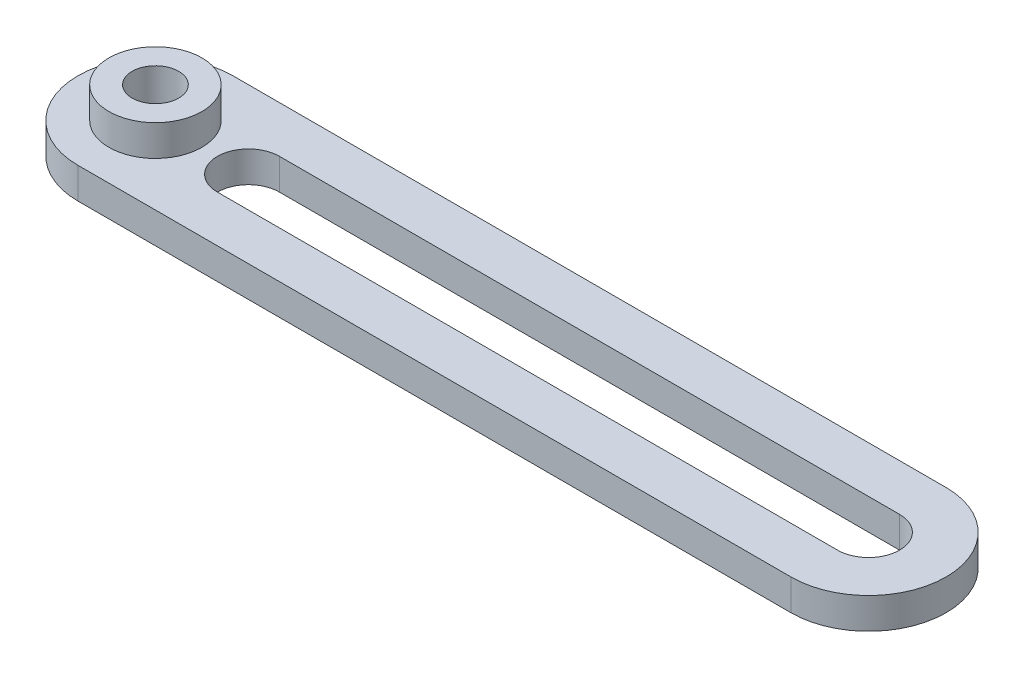
ISO-10303-21;
HEADER;
FILE_DESCRIPTION(('STEP AP214'),'2;1');
FILE_NAME('part.step','',(''),(''),'','','');
FILE_SCHEMA(('AUTOMOTIVE_DESIGN { 1 0 10303 214 1 1 1 1 }'));
ENDSEC;
DATA;
#1=APPLICATION_CONTEXT('core data for automotive mechanical design processes');
#2=APPLICATION_PROTOCOL_DEFINITION('international standard','automotive_design',2000,#1);
#3=PRODUCT_CONTEXT('',#1,'mechanical');
#4=PRODUCT('Part','Part','',(#3));
#5=PRODUCT_RELATED_PRODUCT_CATEGORY('part','',(#4));
#6=PRODUCT_DEFINITION_FORMATION('','',#4);
#7=PRODUCT_DEFINITION_CONTEXT('part definition',#1,'design');
#8=PRODUCT_DEFINITION('design','',#6,#7);
#9=PRODUCT_DEFINITION_SHAPE('','',#8);
#10=(LENGTH_UNIT() NAMED_UNIT(*) SI_UNIT(.MILLI.,.METRE.));
#11=(NAMED_UNIT(*) PLANE_ANGLE_UNIT() SI_UNIT($,.RADIAN.));
#12=(NAMED_UNIT(*) SI_UNIT($,.STERADIAN.) SOLID_ANGLE_UNIT());
#13=UNCERTAINTY_MEASURE_WITH_UNIT(LENGTH_MEASURE(1.E-05),#10,'distance_accuracy_value','');
#14=(GEOMETRIC_REPRESENTATION_CONTEXT(3) GLOBAL_UNCERTAINTY_ASSIGNED_CONTEXT((#13)) GLOBAL_UNIT_ASSIGNED_CONTEXT((#10,
#11,#12)) REPRESENTATION_CONTEXT('',''));
#15=CARTESIAN_POINT('',(0.,0.,0.));
#16=DIRECTION('',(0.,0.,1.));
#17=DIRECTION('',(1.,0.,0.));
#18=AXIS2_PLACEMENT_3D('',#15,#16,#17);
#19=CARTESIAN_POINT('',(0.,10.,0.));
#20=DIRECTION('',(0.,-1.,0.));
#21=DIRECTION('',(0.,0.,-1.));
#22=AXIS2_PLACEMENT_3D('',#19,#20,#21);
#23=PLANE('',#22);
#24=CARTESIAN_POINT('',(-230.,10.,0.));
#25=DIRECTION('',(0.,-1.,0.));
#26=DIRECTION('',(0.,0.,-1.));
#27=AXIS2_PLACEMENT_3D('',#24,#25,#26);
#28=CIRCLE('',#27,15.);
#29=CARTESIAN_POINT('',(-230.,10.,-15.));
#30=VERTEX_POINT('',#29);
#31=EDGE_CURVE('E269',#30,#30,#28,.T.);
#32=ORIENTED_EDGE('',*,*,#31,.T.);
#33=EDGE_LOOP('',(#32));
#34=FACE_BOUND('',#33,.T.);
#35=CARTESIAN_POINT('',(0.,10.,0.));
#36=DIRECTION('',(0.,1.,0.));
#37=DIRECTION('',(0.,0.,-1.));
#38=AXIS2_PLACEMENT_3D('',#35,#36,#37);
#39=CIRCLE('',#38,25.);
#40=CARTESIAN_POINT('',(0.,10.,25.));
#41=VERTEX_POINT('',#40);
#42=CARTESIAN_POINT('',(0.,10.,-25.));
#43=VERTEX_POINT('',#42);
#44=EDGE_CURVE('E157',#41,#43,#39,.T.);
#45=ORIENTED_EDGE('',*,*,#44,.T.);
#46=DIRECTION('',(-1.,0.,0.));
#47=VECTOR('',#46,1.);
#48=CARTESIAN_POINT('',(-230.,10.,-25.));
#49=LINE('',#48,#47);
#50=CARTESIAN_POINT('',(-230.,10.,-25.));
#51=VERTEX_POINT('',#50);
#52=EDGE_CURVE('E161',#43,#51,#49,.T.);
#53=ORIENTED_EDGE('',*,*,#52,.T.);
#54=CARTESIAN_POINT('',(-230.,10.,0.));
#55=DIRECTION('',(0.,1.,0.));
#56=DIRECTION('',(0.,0.,1.));
#57=AXIS2_PLACEMENT_3D('',#54,#55,#56);
#58=CIRCLE('',#57,25.);
#59=CARTESIAN_POINT('',(-230.,10.,25.));
#60=VERTEX_POINT('',#59);
#61=EDGE_CURVE('E165',#51,#60,#58,.T.);
#62=ORIENTED_EDGE('',*,*,#61,.T.);
#63=DIRECTION('',(1.,0.,0.));
#64=VECTOR('',#63,1.);
#65=CARTESIAN_POINT('',(-230.,10.,25.));
#66=LINE('',#65,#64);
#67=EDGE_CURVE('E168',#60,#41,#66,.T.);
#68=ORIENTED_EDGE('',*,*,#67,.T.);
#69=EDGE_LOOP('',(#45,#53,#62,#68));
#70=FACE_BOUND('',#69,.T.);
#71=CARTESIAN_POINT('',(-200.,10.,0.));
#72=DIRECTION('',(0.,1.,0.));
#73=DIRECTION('',(0.,0.,1.));
#74=AXIS2_PLACEMENT_3D('',#71,#72,#73);
#75=CIRCLE('',#74,10.);
#76=CARTESIAN_POINT('',(-200.,10.,-10.));
#77=VERTEX_POINT('',#76);
#78=CARTESIAN_POINT('',(-200.,10.,10.));
#79=VERTEX_POINT('',#78);
#80=EDGE_CURVE('E112',#77,#79,#75,.T.);
#81=ORIENTED_EDGE('',*,*,#80,.F.);
#82=DIRECTION('',(-1.,0.,0.));
#83=VECTOR('',#82,1.);
#84=CARTESIAN_POINT('',(-200.,10.,-10.));
#85=LINE('',#84,#83);
#86=CARTESIAN_POINT('',(0.,10.,-9.99999999999999));
#87=VERTEX_POINT('',#86);
#88=EDGE_CURVE('E106',#87,#77,#85,.T.);
#89=ORIENTED_EDGE('',*,*,#88,.F.);
#90=CARTESIAN_POINT('',(0.,10.,0.));
#91=DIRECTION('',(0.,1.,0.));
#92=DIRECTION('',(0.,0.,1.));
#93=AXIS2_PLACEMENT_3D('',#90,#91,#92);
#94=CIRCLE('',#93,10.);
#95=CARTESIAN_POINT('',(0.,10.,10.));
#96=VERTEX_POINT('',#95);
#97=EDGE_CURVE('E131',#96,#87,#94,.T.);
#98=ORIENTED_EDGE('',*,*,#97,.F.);
#99=DIRECTION('',(1.,0.,0.));
#100=VECTOR('',#99,1.);
#101=CARTESIAN_POINT('',(-200.,10.,10.));
#102=LINE('',#101,#100);
#103=EDGE_CURVE('E127',#79,#96,#102,.T.);
#104=ORIENTED_EDGE('',*,*,#103,.F.);
#105=EDGE_LOOP('',(#81,#89,#98,#104));
#106=FACE_BOUND('',#105,.T.);
#107=ADVANCED_FACE('F43',(#34,#70,#106),#23,.F.);
#108=CARTESIAN_POINT('',(0.,0.,0.));
#109=DIRECTION('',(0.,-1.,0.));
#110=DIRECTION('',(0.,0.,-1.));
#111=AXIS2_PLACEMENT_3D('',#108,#109,#110);
#112=PLANE('',#111);
#113=DIRECTION('',(-1.,0.,0.));
#114=VECTOR('',#113,1.);
#115=CARTESIAN_POINT('',(-190.,0.,-9.99999999999999));
#116=LINE('',#115,#114);
#117=CARTESIAN_POINT('',(0.,0.,-9.99999999999999));
#118=VERTEX_POINT('',#117);
#119=CARTESIAN_POINT('',(-200.,0.,-9.99999999999999));
#120=VERTEX_POINT('',#119);
#121=EDGE_CURVE('E113',#118,#120,#116,.T.);
#122=ORIENTED_EDGE('',*,*,#121,.T.);
#123=CARTESIAN_POINT('',(-200.,0.,0.));
#124=DIRECTION('',(0.,1.,0.));
#125=DIRECTION('',(0.,0.,1.));
#126=AXIS2_PLACEMENT_3D('',#123,#124,#125);
#127=CIRCLE('',#126,10.);
#128=CARTESIAN_POINT('',(-200.,0.,10.));
#129=VERTEX_POINT('',#128);
#130=EDGE_CURVE('E120',#120,#129,#127,.T.);
#131=ORIENTED_EDGE('',*,*,#130,.T.);
#132=DIRECTION('',(1.,0.,0.));
#133=VECTOR('',#132,1.);
#134=CARTESIAN_POINT('',(-190.,0.,10.));
#135=LINE('',#134,#133);
#136=CARTESIAN_POINT('',(0.,0.,10.));
#137=VERTEX_POINT('',#136);
#138=EDGE_CURVE('E139',#129,#137,#135,.T.);
#139=ORIENTED_EDGE('',*,*,#138,.T.);
#140=CARTESIAN_POINT('',(0.,0.,0.));
#141=DIRECTION('',(0.,1.,0.));
#142=DIRECTION('',(0.,0.,1.));
#143=AXIS2_PLACEMENT_3D('',#140,#141,#142);
#144=CIRCLE('',#143,10.);
#145=EDGE_CURVE('E144',#137,#118,#144,.T.);
#146=ORIENTED_EDGE('',*,*,#145,.T.);
#147=EDGE_LOOP('',(#122,#131,#139,#146));
#148=FACE_BOUND('',#147,.T.);
#149=CARTESIAN_POINT('',(0.,0.,0.));
#150=DIRECTION('',(0.,1.,0.));
#151=DIRECTION('',(0.,0.,-1.));
#152=AXIS2_PLACEMENT_3D('',#149,#150,#151);
#153=CIRCLE('',#152,25.);
#154=CARTESIAN_POINT('',(0.,0.,25.));
#155=VERTEX_POINT('',#154);
#156=CARTESIAN_POINT('',(0.,0.,-25.));
#157=VERTEX_POINT('',#156);
#158=EDGE_CURVE('E123',#155,#157,#153,.T.);
#159=ORIENTED_EDGE('',*,*,#158,.F.);
#160=DIRECTION('',(1.,0.,0.));
#161=VECTOR('',#160,1.);
#162=CARTESIAN_POINT('',(-230.,0.,25.));
#163=LINE('',#162,#161);
#164=CARTESIAN_POINT('',(-230.,0.,25.));
#165=VERTEX_POINT('',#164);
#166=EDGE_CURVE('E162',#165,#155,#163,.T.);
#167=ORIENTED_EDGE('',*,*,#166,.F.);
#168=CARTESIAN_POINT('',(-230.,0.,0.));
#169=DIRECTION('',(0.,1.,0.));
#170=DIRECTION('',(0.,0.,1.));
#171=AXIS2_PLACEMENT_3D('',#168,#169,#170);
#172=CIRCLE('',#171,25.);
#173=CARTESIAN_POINT('',(-230.,0.,-25.));
#174=VERTEX_POINT('',#173);
#175=EDGE_CURVE('E178',#174,#165,#172,.T.);
#176=ORIENTED_EDGE('',*,*,#175,.F.);
#177=DIRECTION('',(-1.,0.,0.));
#178=VECTOR('',#177,1.);
#179=CARTESIAN_POINT('',(-230.,0.,-25.));
#180=LINE('',#179,#178);
#181=EDGE_CURVE('E175',#157,#174,#180,.T.);
#182=ORIENTED_EDGE('',*,*,#181,.F.);
#183=EDGE_LOOP('',(#159,#167,#176,#182));
#184=FACE_BOUND('',#183,.T.);
#185=CARTESIAN_POINT('',(-230.,0.,0.));
#186=DIRECTION('',(0.,1.,0.));
#187=DIRECTION('',(0.,0.,1.));
#188=AXIS2_PLACEMENT_3D('',#185,#186,#187);
#189=CIRCLE('',#188,7.50000000000001);
#190=CARTESIAN_POINT('',(-230.,0.,7.50000000000001));
#191=VERTEX_POINT('',#190);
#192=EDGE_CURVE('E140',#191,#191,#189,.T.);
#193=ORIENTED_EDGE('',*,*,#192,.T.);
#194=EDGE_LOOP('',(#193));
#195=FACE_BOUND('',#194,.T.);
#196=ADVANCED_FACE('F201',(#148,#184,#195),#112,.T.);
#197=CARTESIAN_POINT('',(0.,10.,0.));
#198=DIRECTION('',(0.,-1.,0.));
#199=DIRECTION('',(0.,0.,-1.));
#200=AXIS2_PLACEMENT_3D('',#197,#198,#199);
#201=CYLINDRICAL_SURFACE('',#200,25.);
#202=ORIENTED_EDGE('',*,*,#158,.T.);
#203=DIRECTION('',(0.,-1.,0.));
#204=VECTOR('',#203,1.);
#205=CARTESIAN_POINT('',(0.,10.,-25.));
#206=LINE('',#205,#204);
#207=EDGE_CURVE('E11',#43,#157,#206,.T.);
#208=ORIENTED_EDGE('',*,*,#207,.F.);
#209=ORIENTED_EDGE('',*,*,#44,.F.);
#210=DIRECTION('',(0.,-1.,0.));
#211=VECTOR('',#210,1.);
#212=CARTESIAN_POINT('',(0.,10.,25.));
#213=LINE('',#212,#211);
#214=EDGE_CURVE('E171',#41,#155,#213,.T.);
#215=ORIENTED_EDGE('',*,*,#214,.T.);
#216=EDGE_LOOP('',(#202,#208,#209,#215));
#217=FACE_BOUND('',#216,.T.);
#218=ADVANCED_FACE('F45',(#217),#201,.T.);
#219=CARTESIAN_POINT('',(-230.,10.,-25.));
#220=DIRECTION('',(0.,0.,1.));
#221=DIRECTION('',(1.,0.,0.));
#222=AXIS2_PLACEMENT_3D('',#219,#220,#221);
#223=PLANE('',#222);
#224=ORIENTED_EDGE('',*,*,#181,.T.);
#225=DIRECTION('',(0.,-1.,0.));
#226=VECTOR('',#225,1.);
#227=CARTESIAN_POINT('',(-230.,10.,-25.));
#228=LINE('',#227,#226);
#229=EDGE_CURVE('E52',#51,#174,#228,.T.);
#230=ORIENTED_EDGE('',*,*,#229,.F.);
#231=ORIENTED_EDGE('',*,*,#52,.F.);
#232=ORIENTED_EDGE('',*,*,#207,.T.);
#233=EDGE_LOOP('',(#224,#230,#231,#232));
#234=FACE_BOUND('',#233,.T.);
#235=ADVANCED_FACE('F211',(#234),#223,.F.);
#236=CARTESIAN_POINT('',(-230.,10.,0.));
#237=DIRECTION('',(0.,-1.,0.));
#238=DIRECTION('',(0.,0.,-1.));
#239=AXIS2_PLACEMENT_3D('',#236,#237,#238);
#240=CYLINDRICAL_SURFACE('',#239,25.);
#241=ORIENTED_EDGE('',*,*,#175,.T.);
#242=DIRECTION('',(0.,-1.,0.));
#243=VECTOR('',#242,1.);
#244=CARTESIAN_POINT('',(-230.,10.,25.));
#245=LINE('',#244,#243);
#246=EDGE_CURVE('E186',#60,#165,#245,.T.);
#247=ORIENTED_EDGE('',*,*,#246,.F.);
#248=ORIENTED_EDGE('',*,*,#61,.F.);
#249=ORIENTED_EDGE('',*,*,#229,.T.);
#250=EDGE_LOOP('',(#241,#247,#248,#249));
#251=FACE_BOUND('',#250,.T.);
#252=ADVANCED_FACE('F195',(#251),#240,.T.);
#253=CARTESIAN_POINT('',(-230.,10.,25.));
#254=DIRECTION('',(0.,0.,-1.));
#255=DIRECTION('',(-1.,0.,0.));
#256=AXIS2_PLACEMENT_3D('',#253,#254,#255);
#257=PLANE('',#256);
#258=ORIENTED_EDGE('',*,*,#166,.T.);
#259=ORIENTED_EDGE('',*,*,#214,.F.);
#260=ORIENTED_EDGE('',*,*,#67,.F.);
#261=ORIENTED_EDGE('',*,*,#246,.T.);
#262=EDGE_LOOP('',(#258,#259,#260,#261));
#263=FACE_BOUND('',#262,.T.);
#264=ADVANCED_FACE('F205',(#263),#257,.F.);
#265=CARTESIAN_POINT('',(-200.,10.,0.));
#266=DIRECTION('',(0.,-1.,0.));
#267=DIRECTION('',(0.,0.,-1.));
#268=AXIS2_PLACEMENT_3D('',#265,#266,#267);
#269=CYLINDRICAL_SURFACE('',#268,10.);
#270=ORIENTED_EDGE('',*,*,#130,.F.);
#271=DIRECTION('',(0.,-1.,0.));
#272=VECTOR('',#271,1.);
#273=CARTESIAN_POINT('',(-200.,10.,-10.));
#274=LINE('',#273,#272);
#275=EDGE_CURVE('E64',#77,#120,#274,.T.);
#276=ORIENTED_EDGE('',*,*,#275,.F.);
#277=ORIENTED_EDGE('',*,*,#80,.T.);
#278=DIRECTION('',(0.,-1.,0.));
#279=VECTOR('',#278,1.);
#280=CARTESIAN_POINT('',(-200.,10.,10.));
#281=LINE('',#280,#279);
#282=EDGE_CURVE('E124',#79,#129,#281,.T.);
#283=ORIENTED_EDGE('',*,*,#282,.T.);
#284=EDGE_LOOP('',(#270,#276,#277,#283));
#285=FACE_BOUND('',#284,.T.);
#286=ADVANCED_FACE('F116',(#285),#269,.F.);
#287=CARTESIAN_POINT('',(-190.,10.,10.));
#288=DIRECTION('',(0.,0.,-1.));
#289=DIRECTION('',(-1.,0.,0.));
#290=AXIS2_PLACEMENT_3D('',#287,#288,#289);
#291=PLANE('',#290);
#292=ORIENTED_EDGE('',*,*,#138,.F.);
#293=ORIENTED_EDGE('',*,*,#282,.F.);
#294=ORIENTED_EDGE('',*,*,#103,.T.);
#295=DIRECTION('',(0.,-1.,0.));
#296=VECTOR('',#295,1.);
#297=CARTESIAN_POINT('',(0.,10.,10.));
#298=LINE('',#297,#296);
#299=EDGE_CURVE('E152',#96,#137,#298,.T.);
#300=ORIENTED_EDGE('',*,*,#299,.T.);
#301=EDGE_LOOP('',(#292,#293,#294,#300));
#302=FACE_BOUND('',#301,.T.);
#303=ADVANCED_FACE('F234',(#302),#291,.T.);
#304=CARTESIAN_POINT('',(0.,10.,0.));
#305=DIRECTION('',(0.,-1.,0.));
#306=DIRECTION('',(0.,0.,-1.));
#307=AXIS2_PLACEMENT_3D('',#304,#305,#306);
#308=CYLINDRICAL_SURFACE('',#307,10.);
#309=ORIENTED_EDGE('',*,*,#145,.F.);
#310=ORIENTED_EDGE('',*,*,#299,.F.);
#311=ORIENTED_EDGE('',*,*,#97,.T.);
#312=DIRECTION('',(0.,-1.,0.));
#313=VECTOR('',#312,1.);
#314=CARTESIAN_POINT('',(0.,10.,-9.99999999999999));
#315=LINE('',#314,#313);
#316=EDGE_CURVE('E59',#87,#118,#315,.T.);
#317=ORIENTED_EDGE('',*,*,#316,.T.);
#318=EDGE_LOOP('',(#309,#310,#311,#317));
#319=FACE_BOUND('',#318,.T.);
#320=ADVANCED_FACE('F238',(#319),#308,.F.);
#321=CARTESIAN_POINT('',(-190.,10.,-9.99999999999999));
#322=DIRECTION('',(0.,0.,1.));
#323=DIRECTION('',(1.,0.,0.));
#324=AXIS2_PLACEMENT_3D('',#321,#322,#323);
#325=PLANE('',#324);
#326=ORIENTED_EDGE('',*,*,#121,.F.);
#327=ORIENTED_EDGE('',*,*,#316,.F.);
#328=ORIENTED_EDGE('',*,*,#88,.T.);
#329=ORIENTED_EDGE('',*,*,#275,.T.);
#330=EDGE_LOOP('',(#326,#327,#328,#329));
#331=FACE_BOUND('',#330,.T.);
#332=ADVANCED_FACE('F107',(#331),#325,.T.);
#333=CARTESIAN_POINT('',(-230.,10.,0.));
#334=DIRECTION('',(0.,-1.,0.));
#335=DIRECTION('',(0.,0.,-1.));
#336=AXIS2_PLACEMENT_3D('',#333,#334,#335);
#337=CYLINDRICAL_SURFACE('',#336,7.50000000000001);
#338=ORIENTED_EDGE('',*,*,#192,.F.);
#339=EDGE_LOOP('',(#338));
#340=FACE_BOUND('',#339,.T.);
#341=CARTESIAN_POINT('',(-230.,20.,0.));
#342=DIRECTION('',(0.,-1.,0.));
#343=DIRECTION('',(0.,0.,-1.));
#344=AXIS2_PLACEMENT_3D('',#341,#342,#343);
#345=CIRCLE('',#344,7.50000000000001);
#346=CARTESIAN_POINT('',(-230.,20.,-7.50000000000001));
#347=VERTEX_POINT('',#346);
#348=EDGE_CURVE('E264',#347,#347,#345,.T.);
#349=ORIENTED_EDGE('',*,*,#348,.F.);
#350=EDGE_LOOP('',(#349));
#351=FACE_BOUND('',#350,.T.);
#352=ADVANCED_FACE('F248',(#340,#351),#337,.F.);
#353=CARTESIAN_POINT('',(-230.,20.,0.));
#354=DIRECTION('',(0.,-1.,0.));
#355=DIRECTION('',(0.,0.,-1.));
#356=AXIS2_PLACEMENT_3D('',#353,#354,#355);
#357=CYLINDRICAL_SURFACE('',#356,15.);
#358=CARTESIAN_POINT('',(-230.,20.,0.));
#359=DIRECTION('',(0.,-1.,0.));
#360=DIRECTION('',(0.,0.,-1.));
#361=AXIS2_PLACEMENT_3D('',#358,#359,#360);
#362=CIRCLE('',#361,15.);
#363=CARTESIAN_POINT('',(-230.,20.,-15.));
#364=VERTEX_POINT('',#363);
#365=EDGE_CURVE('E267',#364,#364,#362,.T.);
#366=ORIENTED_EDGE('',*,*,#365,.T.);
#367=EDGE_LOOP('',(#366));
#368=FACE_BOUND('',#367,.T.);
#369=ORIENTED_EDGE('',*,*,#31,.F.);
#370=EDGE_LOOP('',(#369));
#371=FACE_BOUND('',#370,.T.);
#372=ADVANCED_FACE('F251',(#368,#371),#357,.T.);
#373=CARTESIAN_POINT('',(-230.,20.,0.));
#374=DIRECTION('',(0.,-1.,0.));
#375=DIRECTION('',(0.,0.,-1.));
#376=AXIS2_PLACEMENT_3D('',#373,#374,#375);
#377=PLANE('',#376);
#378=ORIENTED_EDGE('',*,*,#348,.T.);
#379=EDGE_LOOP('',(#378));
#380=FACE_BOUND('',#379,.T.);
#381=ORIENTED_EDGE('',*,*,#365,.F.);
#382=EDGE_LOOP('',(#381));
#383=FACE_BOUND('',#382,.T.);
#384=ADVANCED_FACE('F255',(#380,#383),#377,.F.);
#385=CLOSED_SHELL('',(#107,#196,#218,#235,#252,#264,#286,#303,#320,#332,#352,#372,#384));
#386=MANIFOLD_SOLID_BREP('B2',#385);
#387=ADVANCED_BREP_SHAPE_REPRESENTATION('',(#18,#386),#14);
#388=SHAPE_DEFINITION_REPRESENTATION(#9,#387);
ENDSEC;
END-ISO-10303-21;
